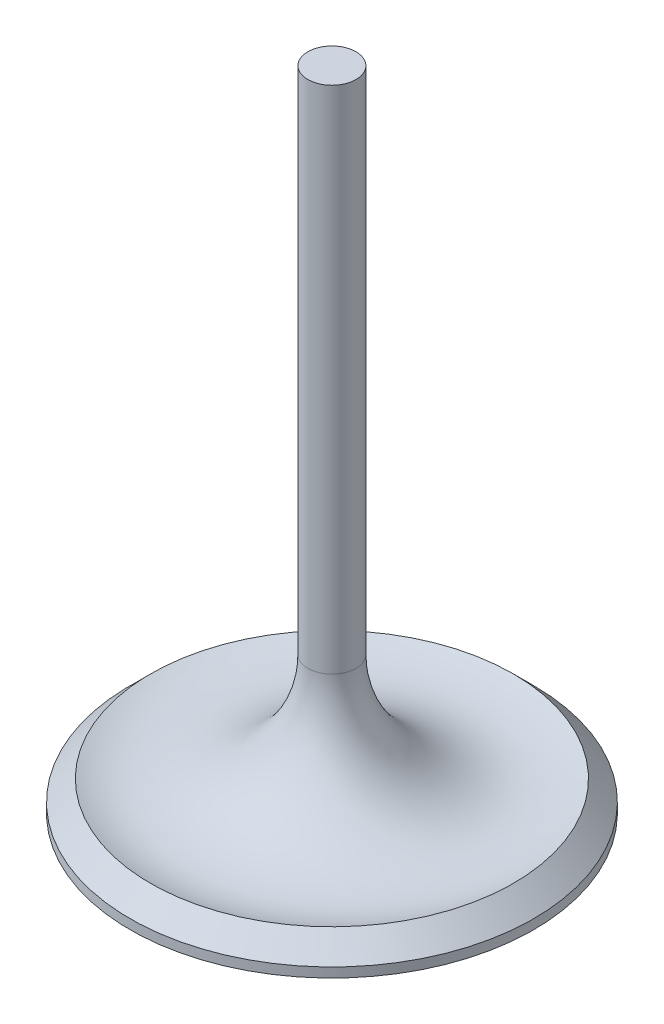
ISO-10303-21;
HEADER;
FILE_DESCRIPTION(('STEP AP214'),'2;1');
FILE_NAME('part.step','',(''),(''),'','','');
FILE_SCHEMA(('AUTOMOTIVE_DESIGN { 1 0 10303 214 1 1 1 1 }'));
ENDSEC;
DATA;
#1=APPLICATION_CONTEXT('core data for automotive mechanical design processes');
#2=APPLICATION_PROTOCOL_DEFINITION('international standard','automotive_design',2000,#1);
#3=PRODUCT_CONTEXT('',#1,'mechanical');
#4=PRODUCT('Part','Part','',(#3));
#5=PRODUCT_RELATED_PRODUCT_CATEGORY('part','',(#4));
#6=PRODUCT_DEFINITION_FORMATION('','',#4);
#7=PRODUCT_DEFINITION_CONTEXT('part definition',#1,'design');
#8=PRODUCT_DEFINITION('design','',#6,#7);
#9=PRODUCT_DEFINITION_SHAPE('','',#8);
#10=(LENGTH_UNIT() NAMED_UNIT(*) SI_UNIT(.MILLI.,.METRE.));
#11=(NAMED_UNIT(*) PLANE_ANGLE_UNIT() SI_UNIT($,.RADIAN.));
#12=(NAMED_UNIT(*) SI_UNIT($,.STERADIAN.) SOLID_ANGLE_UNIT());
#13=UNCERTAINTY_MEASURE_WITH_UNIT(LENGTH_MEASURE(1.E-05),#10,'distance_accuracy_value','');
#14=(GEOMETRIC_REPRESENTATION_CONTEXT(3) GLOBAL_UNCERTAINTY_ASSIGNED_CONTEXT((#13)) GLOBAL_UNIT_ASSIGNED_CONTEXT((#10,
#11,#12)) REPRESENTATION_CONTEXT('',''));
#15=CARTESIAN_POINT('',(0.,0.,0.));
#16=DIRECTION('',(0.,0.,1.));
#17=DIRECTION('',(1.,0.,0.));
#18=AXIS2_PLACEMENT_3D('',#15,#16,#17);
#19=CARTESIAN_POINT('',(26.67,0.,0.));
#20=DIRECTION('',(0.,-1.,0.));
#21=DIRECTION('',(0.,0.,-1.));
#22=AXIS2_PLACEMENT_3D('',#19,#20,#21);
#23=PLANE('',#22);
#24=CARTESIAN_POINT('',(0.,0.,0.));
#25=DIRECTION('',(0.,-1.,0.));
#26=DIRECTION('',(0.,0.,-1.));
#27=AXIS2_PLACEMENT_3D('',#24,#25,#26);
#28=CIRCLE('',#27,26.67);
#29=CARTESIAN_POINT('',(0.,0.,-26.67));
#30=VERTEX_POINT('',#29);
#31=EDGE_CURVE('E10',#30,#30,#28,.T.);
#32=ORIENTED_EDGE('',*,*,#31,.T.);
#33=EDGE_LOOP('',(#32));
#34=FACE_BOUND('',#33,.T.);
#35=ADVANCED_FACE('F41',(#34),#23,.T.);
#36=CARTESIAN_POINT('',(0.,0.,0.));
#37=DIRECTION('',(0.,-1.,0.));
#38=DIRECTION('',(0.,0.,-1.));
#39=AXIS2_PLACEMENT_3D('',#36,#37,#38);
#40=CYLINDRICAL_SURFACE('',#39,26.67);
#41=CARTESIAN_POINT('',(0.,1.27,0.));
#42=DIRECTION('',(0.,-1.,0.));
#43=DIRECTION('',(0.,0.,-1.));
#44=AXIS2_PLACEMENT_3D('',#41,#42,#43);
#45=CIRCLE('',#44,26.67);
#46=CARTESIAN_POINT('',(0.,1.27,-26.67));
#47=VERTEX_POINT('',#46);
#48=EDGE_CURVE('E48',#47,#47,#45,.T.);
#49=ORIENTED_EDGE('',*,*,#48,.T.);
#50=EDGE_LOOP('',(#49));
#51=FACE_BOUND('',#50,.T.);
#52=ORIENTED_EDGE('',*,*,#31,.F.);
#53=EDGE_LOOP('',(#52));
#54=FACE_BOUND('',#53,.T.);
#55=ADVANCED_FACE('F81',(#51,#54),#40,.T.);
#56=CARTESIAN_POINT('',(0.,1.27,0.));
#57=DIRECTION('',(0.,-1.,0.));
#58=DIRECTION('',(0.,0.,-1.));
#59=AXIS2_PLACEMENT_3D('',#56,#57,#58);
#60=CONICAL_SURFACE('',#59,26.67,0.785398163397455);
#61=CARTESIAN_POINT('',(0.,3.96407683632073,0.));
#62=DIRECTION('',(0.,-1.,0.));
#63=DIRECTION('',(0.,0.,-1.));
#64=AXIS2_PLACEMENT_3D('',#61,#62,#63);
#65=CIRCLE('',#64,23.9759231636792);
#66=CARTESIAN_POINT('',(0.,3.96407683632073,-23.9759231636792));
#67=VERTEX_POINT('',#66);
#68=EDGE_CURVE('E53',#67,#67,#65,.T.);
#69=ORIENTED_EDGE('',*,*,#68,.T.);
#70=EDGE_LOOP('',(#69));
#71=FACE_BOUND('',#70,.T.);
#72=ORIENTED_EDGE('',*,*,#48,.F.);
#73=EDGE_LOOP('',(#72));
#74=FACE_BOUND('',#73,.T.);
#75=ADVANCED_FACE('F85',(#71,#74),#60,.T.);
#76=CARTESIAN_POINT('',(0.,18.1698938231246,0.));
#77=DIRECTION('',(0.,-1.,0.));
#78=DIRECTION('',(0.,0.,-1.));
#79=AXIS2_PLACEMENT_3D('',#76,#77,#78);
#80=TOROIDAL_SURFACE('',#79,18.43,15.25);
#81=CARTESIAN_POINT('',(0.,18.1698938231246,0.));
#82=DIRECTION('',(0.,-1.,0.));
#83=DIRECTION('',(0.,0.,-1.));
#84=AXIS2_PLACEMENT_3D('',#81,#82,#83);
#85=CIRCLE('',#84,3.18000000000001);
#86=CARTESIAN_POINT('',(0.,18.1698938231246,-3.18000000000001));
#87=VERTEX_POINT('',#86);
#88=EDGE_CURVE('E58',#87,#87,#85,.T.);
#89=ORIENTED_EDGE('',*,*,#88,.T.);
#90=EDGE_LOOP('',(#89));
#91=FACE_BOUND('',#90,.T.);
#92=ORIENTED_EDGE('',*,*,#68,.F.);
#93=EDGE_LOOP('',(#92));
#94=FACE_BOUND('',#93,.T.);
#95=ADVANCED_FACE('F78',(#91,#94),#80,.F.);
#96=CARTESIAN_POINT('',(0.,0.,0.));
#97=DIRECTION('',(0.,-1.,0.));
#98=DIRECTION('',(0.,0.,-1.));
#99=AXIS2_PLACEMENT_3D('',#96,#97,#98);
#100=CYLINDRICAL_SURFACE('',#99,3.18000000000001);
#101=CARTESIAN_POINT('',(0.,85.55,0.));
#102=DIRECTION('',(0.,-1.,0.));
#103=DIRECTION('',(0.,0.,-1.));
#104=AXIS2_PLACEMENT_3D('',#101,#102,#103);
#105=CIRCLE('',#104,3.18);
#106=CARTESIAN_POINT('',(0.,85.55,-3.18));
#107=VERTEX_POINT('',#106);
#108=EDGE_CURVE('E64',#107,#107,#105,.T.);
#109=ORIENTED_EDGE('',*,*,#108,.T.);
#110=EDGE_LOOP('',(#109));
#111=FACE_BOUND('',#110,.T.);
#112=ORIENTED_EDGE('',*,*,#88,.F.);
#113=EDGE_LOOP('',(#112));
#114=FACE_BOUND('',#113,.T.);
#115=ADVANCED_FACE('F69',(#111,#114),#100,.T.);
#116=CARTESIAN_POINT('',(0.,85.55,0.));
#117=DIRECTION('',(0.,1.,0.));
#118=DIRECTION('',(0.,0.,1.));
#119=AXIS2_PLACEMENT_3D('',#116,#117,#118);
#120=PLANE('',#119);
#121=ORIENTED_EDGE('',*,*,#108,.F.);
#122=EDGE_LOOP('',(#121));
#123=FACE_BOUND('',#122,.T.);
#124=ADVANCED_FACE('F72',(#123),#120,.T.);
#125=CLOSED_SHELL('',(#35,#55,#75,#95,#115,#124));
#126=MANIFOLD_SOLID_BREP('B2',#125);
#127=ADVANCED_BREP_SHAPE_REPRESENTATION('',(#18,#126),#14);
#128=SHAPE_DEFINITION_REPRESENTATION(#9,#127);
ENDSEC;
END-ISO-10303-21;
